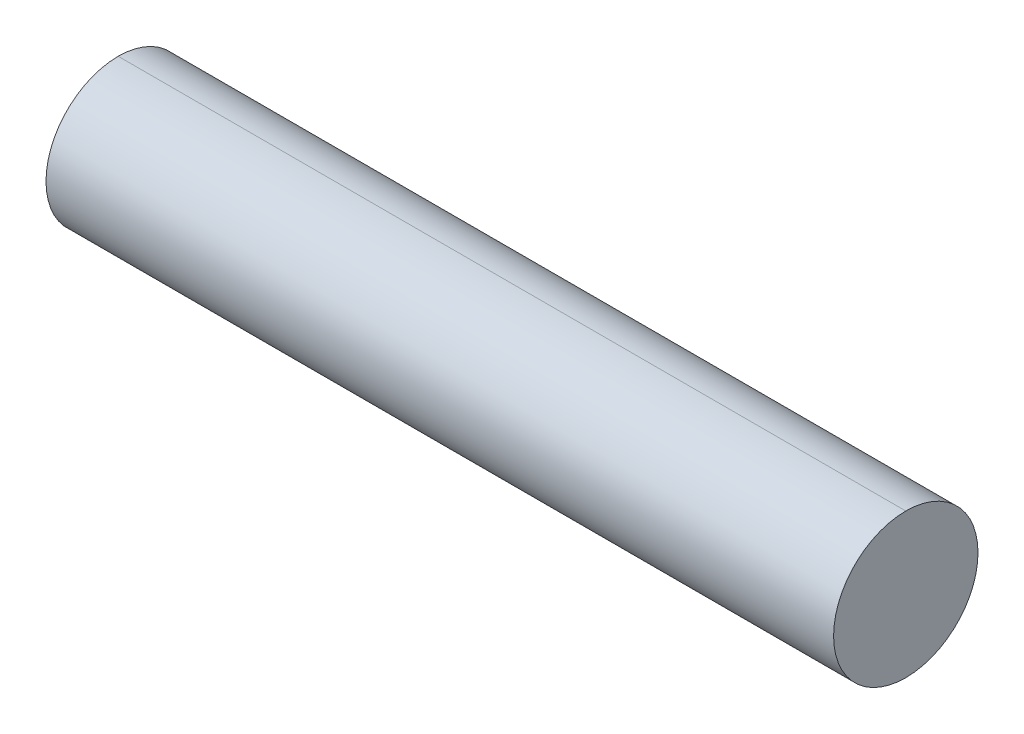
ISO-10303-21;
HEADER;
FILE_DESCRIPTION(('STEP AP214'),'2;1');
FILE_NAME('part.step','',(''),(''),'','','');
FILE_SCHEMA(('AUTOMOTIVE_DESIGN { 1 0 10303 214 1 1 1 1 }'));
ENDSEC;
DATA;
#1=APPLICATION_CONTEXT('core data for automotive mechanical design processes');
#2=APPLICATION_PROTOCOL_DEFINITION('international standard','automotive_design',2000,#1);
#3=PRODUCT_CONTEXT('',#1,'mechanical');
#4=PRODUCT('Part','Part','',(#3));
#5=PRODUCT_RELATED_PRODUCT_CATEGORY('part','',(#4));
#6=PRODUCT_DEFINITION_FORMATION('','',#4);
#7=PRODUCT_DEFINITION_CONTEXT('part definition',#1,'design');
#8=PRODUCT_DEFINITION('design','',#6,#7);
#9=PRODUCT_DEFINITION_SHAPE('','',#8);
#10=(LENGTH_UNIT() NAMED_UNIT(*) SI_UNIT(.MILLI.,.METRE.));
#11=(NAMED_UNIT(*) PLANE_ANGLE_UNIT() SI_UNIT($,.RADIAN.));
#12=(NAMED_UNIT(*) SI_UNIT($,.STERADIAN.) SOLID_ANGLE_UNIT());
#13=UNCERTAINTY_MEASURE_WITH_UNIT(LENGTH_MEASURE(1.E-05),#10,'distance_accuracy_value','');
#14=(GEOMETRIC_REPRESENTATION_CONTEXT(3) GLOBAL_UNCERTAINTY_ASSIGNED_CONTEXT((#13)) GLOBAL_UNIT_ASSIGNED_CONTEXT((#10,
#11,#12)) REPRESENTATION_CONTEXT('',''));
#15=CARTESIAN_POINT('',(0.,0.,0.));
#16=DIRECTION('',(0.,0.,1.));
#17=DIRECTION('',(1.,0.,0.));
#18=AXIS2_PLACEMENT_3D('',#15,#16,#17);
#19=CARTESIAN_POINT('',(228.6,0.,0.));
#20=DIRECTION('',(-1.,0.,0.));
#21=DIRECTION('',(0.,0.,1.));
#22=AXIS2_PLACEMENT_3D('',#19,#20,#21);
#23=CYLINDRICAL_SURFACE('',#22,19.05);
#24=DIRECTION('',(-1.,0.,0.));
#25=VECTOR('',#24,1.);
#26=CARTESIAN_POINT('',(228.6,-19.05,0.));
#27=LINE('',#26,#25);
#28=CARTESIAN_POINT('',(228.6,-19.05,0.));
#29=VERTEX_POINT('',#28);
#30=CARTESIAN_POINT('',(20.8000000000001,-19.05,0.));
#31=VERTEX_POINT('',#30);
#32=EDGE_CURVE('E11',#29,#31,#27,.T.);
#33=ORIENTED_EDGE('',*,*,#32,.T.);
#34=CARTESIAN_POINT('',(20.8000000000001,0.,0.));
#35=DIRECTION('',(1.,0.,0.));
#36=DIRECTION('',(0.,0.,-1.));
#37=AXIS2_PLACEMENT_3D('',#34,#35,#36);
#38=CIRCLE('',#37,19.05);
#39=CARTESIAN_POINT('',(20.8000000000001,19.05,0.));
#40=VERTEX_POINT('',#39);
#41=EDGE_CURVE('E52',#40,#31,#38,.F.);
#42=ORIENTED_EDGE('',*,*,#41,.F.);
#43=DIRECTION('',(1.,0.,0.));
#44=VECTOR('',#43,1.);
#45=CARTESIAN_POINT('',(228.6,19.05,0.));
#46=LINE('',#45,#44);
#47=CARTESIAN_POINT('',(228.6,19.05,0.));
#48=VERTEX_POINT('',#47);
#49=EDGE_CURVE('E46',#40,#48,#46,.T.);
#50=ORIENTED_EDGE('',*,*,#49,.T.);
#51=CARTESIAN_POINT('',(228.6,0.,0.));
#52=DIRECTION('',(1.,0.,0.));
#53=DIRECTION('',(0.,0.,-1.));
#54=AXIS2_PLACEMENT_3D('',#51,#52,#53);
#55=CIRCLE('',#54,19.05);
#56=EDGE_CURVE('E66',#29,#48,#55,.T.);
#57=ORIENTED_EDGE('',*,*,#56,.F.);
#58=EDGE_LOOP('',(#33,#42,#50,#57));
#59=FACE_BOUND('',#58,.T.);
#60=ADVANCED_FACE('F37',(#59),#23,.T.);
#61=ORIENTED_EDGE('',*,*,#49,.F.);
#62=EDGE_CURVE('E63',#31,#40,#38,.F.);
#63=ORIENTED_EDGE('',*,*,#62,.F.);
#64=ORIENTED_EDGE('',*,*,#32,.F.);
#65=EDGE_CURVE('E71',#48,#29,#55,.T.);
#66=ORIENTED_EDGE('',*,*,#65,.F.);
#67=EDGE_LOOP('',(#61,#63,#64,#66));
#68=FACE_BOUND('',#67,.T.);
#69=ADVANCED_FACE('F39',(#68),#23,.T.);
#70=CARTESIAN_POINT('',(228.6,0.,0.));
#71=DIRECTION('',(1.,0.,0.));
#72=DIRECTION('',(0.,0.,-1.));
#73=AXIS2_PLACEMENT_3D('',#70,#71,#72);
#74=PLANE('',#73);
#75=ORIENTED_EDGE('',*,*,#65,.T.);
#76=ORIENTED_EDGE('',*,*,#56,.T.);
#77=EDGE_LOOP('',(#75,#76));
#78=FACE_BOUND('',#77,.T.);
#79=ADVANCED_FACE('F77',(#78),#74,.T.);
#80=CARTESIAN_POINT('',(20.8000000000001,-43.753071948073,-171.629174953174));
#81=DIRECTION('',(1.,0.,0.));
#82=DIRECTION('',(0.,0.0040627658389676,-0.999991746932812));
#83=AXIS2_PLACEMENT_3D('',#80,#81,#82);
#84=PLANE('',#83);
#85=ORIENTED_EDGE('',*,*,#62,.T.);
#86=ORIENTED_EDGE('',*,*,#41,.T.);
#87=EDGE_LOOP('',(#85,#86));
#88=FACE_BOUND('',#87,.T.);
#89=ADVANCED_FACE('F64',(#88),#84,.F.);
#90=CLOSED_SHELL('',(#60,#69,#79,#89));
#91=MANIFOLD_SOLID_BREP('B2',#90);
#92=ADVANCED_BREP_SHAPE_REPRESENTATION('',(#18,#91),#14);
#93=SHAPE_DEFINITION_REPRESENTATION(#9,#92);
ENDSEC;
END-ISO-10303-21;
